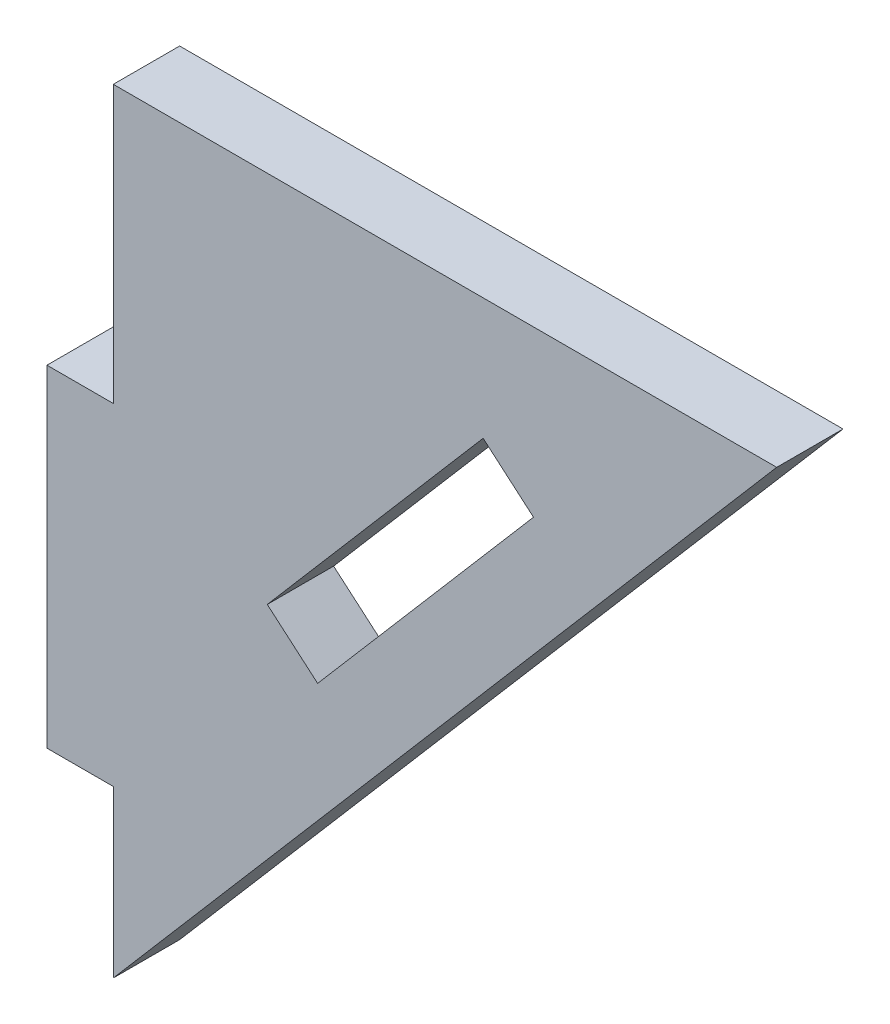
ISO-10303-21;
HEADER;
FILE_DESCRIPTION(('STEP AP214'),'2;1');
FILE_NAME('part.step','',(''),(''),'','','');
FILE_SCHEMA(('AUTOMOTIVE_DESIGN { 1 0 10303 214 1 1 1 1 }'));
ENDSEC;
DATA;
#1=APPLICATION_CONTEXT('core data for automotive mechanical design processes');
#2=APPLICATION_PROTOCOL_DEFINITION('international standard','automotive_design',2000,#1);
#3=PRODUCT_CONTEXT('',#1,'mechanical');
#4=PRODUCT('Part','Part','',(#3));
#5=PRODUCT_RELATED_PRODUCT_CATEGORY('part','',(#4));
#6=PRODUCT_DEFINITION_FORMATION('','',#4);
#7=PRODUCT_DEFINITION_CONTEXT('part definition',#1,'design');
#8=PRODUCT_DEFINITION('design','',#6,#7);
#9=PRODUCT_DEFINITION_SHAPE('','',#8);
#10=(LENGTH_UNIT() NAMED_UNIT(*) SI_UNIT(.MILLI.,.METRE.));
#11=(NAMED_UNIT(*) PLANE_ANGLE_UNIT() SI_UNIT($,.RADIAN.));
#12=(NAMED_UNIT(*) SI_UNIT($,.STERADIAN.) SOLID_ANGLE_UNIT());
#13=UNCERTAINTY_MEASURE_WITH_UNIT(LENGTH_MEASURE(1.E-05),#10,'distance_accuracy_value','');
#14=(GEOMETRIC_REPRESENTATION_CONTEXT(3) GLOBAL_UNCERTAINTY_ASSIGNED_CONTEXT((#13)) GLOBAL_UNIT_ASSIGNED_CONTEXT((#10,
#11,#12)) REPRESENTATION_CONTEXT('',''));
#15=CARTESIAN_POINT('',(0.,0.,0.));
#16=DIRECTION('',(0.,0.,1.));
#17=DIRECTION('',(1.,0.,0.));
#18=AXIS2_PLACEMENT_3D('',#15,#16,#17);
#19=CARTESIAN_POINT('',(-3.8926922259256,3.33659333650765,3.));
#20=DIRECTION('',(0.759256602365296,-0.650791373455968,0.));
#21=DIRECTION('',(0.650791373455968,0.759256602365297,0.));
#22=AXIS2_PLACEMENT_3D('',#19,#20,#21);
#23=PLANE('',#22);
#24=DIRECTION('',(-0.650791373455969,-0.759256602365297,0.));
#25=VECTOR('',#24,1.);
#26=CARTESIAN_POINT('',(-3.8926922259256,3.33659333650765,0.));
#27=LINE('',#26,#25);
#28=CARTESIAN_POINT('',(4.00247852532393,12.5476258796321,0.));
#29=VERTEX_POINT('',#28);
#30=CARTESIAN_POINT('',(-5.7593920765156,1.15877684415265,0.));
#31=VERTEX_POINT('',#30);
#32=EDGE_CURVE('E189',#29,#31,#27,.T.);
#33=ORIENTED_EDGE('',*,*,#32,.T.);
#34=DIRECTION('',(0.,0.,-1.));
#35=VECTOR('',#34,1.);
#36=CARTESIAN_POINT('',(-5.7593920765156,1.15877684415265,3.));
#37=LINE('',#36,#35);
#38=CARTESIAN_POINT('',(-5.7593920765156,1.15877684415265,3.));
#39=VERTEX_POINT('',#38);
#40=EDGE_CURVE('E11',#39,#31,#37,.T.);
#41=ORIENTED_EDGE('',*,*,#40,.F.);
#42=DIRECTION('',(-0.650791373455969,-0.759256602365297,0.));
#43=VECTOR('',#42,1.);
#44=CARTESIAN_POINT('',(-3.8926922259256,3.33659333650765,3.));
#45=LINE('',#44,#43);
#46=CARTESIAN_POINT('',(4.00247852532393,12.5476258796321,3.));
#47=VERTEX_POINT('',#46);
#48=EDGE_CURVE('E145',#47,#39,#45,.T.);
#49=ORIENTED_EDGE('',*,*,#48,.F.);
#50=DIRECTION('',(0.,0.,-1.));
#51=VECTOR('',#50,1.);
#52=CARTESIAN_POINT('',(4.00247852532393,12.5476258796321,3.));
#53=LINE('',#52,#51);
#54=EDGE_CURVE('E67',#47,#29,#53,.T.);
#55=ORIENTED_EDGE('',*,*,#54,.T.);
#56=EDGE_LOOP('',(#33,#41,#49,#55));
#57=FACE_BOUND('',#56,.T.);
#58=ADVANCED_FACE('F47',(#57),#23,.F.);
#59=CARTESIAN_POINT('',(-1.86669985059,-2.177816492355,3.));
#60=DIRECTION('',(-0.650791373455969,-0.759256602365297,0.));
#61=DIRECTION('',(0.759256602365297,-0.650791373455969,0.));
#62=AXIS2_PLACEMENT_3D('',#59,#60,#61);
#63=PLANE('',#62);
#64=DIRECTION('',(-0.759256602365296,0.650791373455969,0.));
#65=VECTOR('',#64,1.);
#66=CARTESIAN_POINT('',(-1.86669985059,-2.177816492355,0.));
#67=LINE('',#66,#65);
#68=CARTESIAN_POINT('',(-8.03716188361148,3.11115096452056,0.));
#69=VERTEX_POINT('',#68);
#70=EDGE_CURVE('E152',#31,#69,#67,.T.);
#71=ORIENTED_EDGE('',*,*,#70,.T.);
#72=DIRECTION('',(0.,0.,-1.));
#73=VECTOR('',#72,1.);
#74=CARTESIAN_POINT('',(-8.03716188361148,3.11115096452056,3.));
#75=LINE('',#74,#73);
#76=CARTESIAN_POINT('',(-8.03716188361148,3.11115096452056,3.));
#77=VERTEX_POINT('',#76);
#78=EDGE_CURVE('E58',#77,#69,#75,.T.);
#79=ORIENTED_EDGE('',*,*,#78,.F.);
#80=DIRECTION('',(-0.759256602365296,0.650791373455969,0.));
#81=VECTOR('',#80,1.);
#82=CARTESIAN_POINT('',(-1.86669985059,-2.177816492355,3.));
#83=LINE('',#82,#81);
#84=EDGE_CURVE('E139',#39,#77,#83,.T.);
#85=ORIENTED_EDGE('',*,*,#84,.F.);
#86=ORIENTED_EDGE('',*,*,#40,.T.);
#87=EDGE_LOOP('',(#71,#79,#85,#86));
#88=FACE_BOUND('',#87,.T.);
#89=ADVANCED_FACE('F151',(#88),#63,.F.);
#90=CARTESIAN_POINT('',(-6.17046203302148,5.28896745687555,3.));
#91=DIRECTION('',(0.759256602365297,-0.650791373455968,0.));
#92=DIRECTION('',(0.650791373455968,0.759256602365297,0.));
#93=AXIS2_PLACEMENT_3D('',#90,#91,#92);
#94=PLANE('',#93);
#95=DIRECTION('',(-0.650791373455968,-0.759256602365297,0.));
#96=VECTOR('',#95,1.);
#97=CARTESIAN_POINT('',(-6.17046203302148,5.28896745687555,0.));
#98=LINE('',#97,#96);
#99=CARTESIAN_POINT('',(1.72470871822804,14.5,0.));
#100=VERTEX_POINT('',#99);
#101=EDGE_CURVE('E194',#100,#69,#98,.T.);
#102=ORIENTED_EDGE('',*,*,#101,.F.);
#103=DIRECTION('',(0.,0.,-1.));
#104=VECTOR('',#103,1.);
#105=CARTESIAN_POINT('',(1.72470871822804,14.5,3.));
#106=LINE('',#105,#104);
#107=CARTESIAN_POINT('',(1.72470871822804,14.5,3.));
#108=VERTEX_POINT('',#107);
#109=EDGE_CURVE('E102',#108,#100,#106,.T.);
#110=ORIENTED_EDGE('',*,*,#109,.F.);
#111=DIRECTION('',(-0.650791373455968,-0.759256602365297,0.));
#112=VECTOR('',#111,1.);
#113=CARTESIAN_POINT('',(-6.17046203302148,5.28896745687555,3.));
#114=LINE('',#113,#112);
#115=EDGE_CURVE('E144',#108,#77,#114,.T.);
#116=ORIENTED_EDGE('',*,*,#115,.T.);
#117=ORIENTED_EDGE('',*,*,#78,.T.);
#118=EDGE_LOOP('',(#102,#110,#116,#117));
#119=FACE_BOUND('',#118,.T.);
#120=ADVANCED_FACE('F157',(#119),#94,.T.);
#121=CARTESIAN_POINT('',(-15.,0.,3.));
#122=DIRECTION('',(-1.,0.,0.));
#123=DIRECTION('',(0.,0.,1.));
#124=AXIS2_PLACEMENT_3D('',#121,#122,#123);
#125=PLANE('',#124);
#126=DIRECTION('',(0.,1.,0.));
#127=VECTOR('',#126,1.);
#128=CARTESIAN_POINT('',(-15.,0.,0.));
#129=LINE('',#128,#127);
#130=CARTESIAN_POINT('',(-15.,-15.,0.));
#131=VERTEX_POINT('',#130);
#132=CARTESIAN_POINT('',(-15.,-7.50000000000001,0.));
#133=VERTEX_POINT('',#132);
#134=EDGE_CURVE('E166',#131,#133,#129,.T.);
#135=ORIENTED_EDGE('',*,*,#134,.F.);
#136=DIRECTION('',(0.,0.,-1.));
#137=VECTOR('',#136,1.);
#138=CARTESIAN_POINT('',(-15.,-15.,3.));
#139=LINE('',#138,#137);
#140=CARTESIAN_POINT('',(-15.,-15.,3.));
#141=VERTEX_POINT('',#140);
#142=EDGE_CURVE('E51',#141,#131,#139,.T.);
#143=ORIENTED_EDGE('',*,*,#142,.F.);
#144=DIRECTION('',(0.,1.,0.));
#145=VECTOR('',#144,1.);
#146=CARTESIAN_POINT('',(-15.,0.,3.));
#147=LINE('',#146,#145);
#148=CARTESIAN_POINT('',(-15.,-7.50000000000001,3.));
#149=VERTEX_POINT('',#148);
#150=EDGE_CURVE('E201',#141,#149,#147,.T.);
#151=ORIENTED_EDGE('',*,*,#150,.T.);
#152=DIRECTION('',(0.,0.,-1.));
#153=VECTOR('',#152,1.);
#154=CARTESIAN_POINT('',(-15.,-7.50000000000001,3.));
#155=LINE('',#154,#153);
#156=EDGE_CURVE('E162',#149,#133,#155,.T.);
#157=ORIENTED_EDGE('',*,*,#156,.T.);
#158=EDGE_LOOP('',(#135,#143,#151,#157));
#159=FACE_BOUND('',#158,.T.);
#160=ADVANCED_FACE('F237',(#159),#125,.T.);
#161=CARTESIAN_POINT('',(-1.23529411764706,1.05882352941177,3.));
#162=DIRECTION('',(-0.759256602365297,0.650791373455968,0.));
#163=DIRECTION('',(-0.650791373455968,-0.759256602365297,0.));
#164=AXIS2_PLACEMENT_3D('',#161,#162,#163);
#165=PLANE('',#164);
#166=DIRECTION('',(0.650791373455968,0.759256602365297,0.));
#167=VECTOR('',#166,1.);
#168=CARTESIAN_POINT('',(-1.23529411764706,1.05882352941177,0.));
#169=LINE('',#168,#167);
#170=CARTESIAN_POINT('',(15.,20.,0.));
#171=VERTEX_POINT('',#170);
#172=EDGE_CURVE('E170',#131,#171,#169,.T.);
#173=ORIENTED_EDGE('',*,*,#172,.T.);
#174=DIRECTION('',(0.,0.,-1.));
#175=VECTOR('',#174,1.);
#176=CARTESIAN_POINT('',(15.,20.,3.));
#177=LINE('',#176,#175);
#178=CARTESIAN_POINT('',(15.,20.,3.));
#179=VERTEX_POINT('',#178);
#180=EDGE_CURVE('E220',#179,#171,#177,.T.);
#181=ORIENTED_EDGE('',*,*,#180,.F.);
#182=DIRECTION('',(0.650791373455968,0.759256602365297,0.));
#183=VECTOR('',#182,1.);
#184=CARTESIAN_POINT('',(-1.23529411764706,1.05882352941177,3.));
#185=LINE('',#184,#183);
#186=EDGE_CURVE('E230',#141,#179,#185,.T.);
#187=ORIENTED_EDGE('',*,*,#186,.F.);
#188=ORIENTED_EDGE('',*,*,#142,.T.);
#189=EDGE_LOOP('',(#173,#181,#187,#188));
#190=FACE_BOUND('',#189,.T.);
#191=ADVANCED_FACE('F49',(#190),#165,.F.);
#192=CARTESIAN_POINT('',(0.,20.,3.));
#193=DIRECTION('',(0.,-1.,0.));
#194=DIRECTION('',(1.,0.,0.));
#195=AXIS2_PLACEMENT_3D('',#192,#193,#194);
#196=PLANE('',#195);
#197=DIRECTION('',(-1.,0.,0.));
#198=VECTOR('',#197,1.);
#199=CARTESIAN_POINT('',(0.,20.,0.));
#200=LINE('',#199,#198);
#201=CARTESIAN_POINT('',(-15.,20.,0.));
#202=VERTEX_POINT('',#201);
#203=EDGE_CURVE('E174',#171,#202,#200,.T.);
#204=ORIENTED_EDGE('',*,*,#203,.T.);
#205=DIRECTION('',(0.,0.,-1.));
#206=VECTOR('',#205,1.);
#207=CARTESIAN_POINT('',(-15.,20.,3.));
#208=LINE('',#207,#206);
#209=CARTESIAN_POINT('',(-15.,20.,3.));
#210=VERTEX_POINT('',#209);
#211=EDGE_CURVE('E218',#210,#202,#208,.T.);
#212=ORIENTED_EDGE('',*,*,#211,.F.);
#213=DIRECTION('',(-1.,0.,0.));
#214=VECTOR('',#213,1.);
#215=CARTESIAN_POINT('',(0.,20.,3.));
#216=LINE('',#215,#214);
#217=EDGE_CURVE('E264',#179,#210,#216,.T.);
#218=ORIENTED_EDGE('',*,*,#217,.F.);
#219=ORIENTED_EDGE('',*,*,#180,.T.);
#220=EDGE_LOOP('',(#204,#212,#218,#219));
#221=FACE_BOUND('',#220,.T.);
#222=ADVANCED_FACE('F346',(#221),#196,.F.);
#223=CARTESIAN_POINT('',(-15.,7.49999999999999,0.));
#224=VERTEX_POINT('',#223);
#225=EDGE_CURVE('E171',#224,#202,#129,.T.);
#226=ORIENTED_EDGE('',*,*,#225,.F.);
#227=DIRECTION('',(0.,0.,-1.));
#228=VECTOR('',#227,1.);
#229=CARTESIAN_POINT('',(-15.,7.49999999999999,3.));
#230=LINE('',#229,#228);
#231=CARTESIAN_POINT('',(-15.,7.49999999999999,3.));
#232=VERTEX_POINT('',#231);
#233=EDGE_CURVE('E215',#232,#224,#230,.T.);
#234=ORIENTED_EDGE('',*,*,#233,.F.);
#235=EDGE_CURVE('E262',#232,#210,#147,.T.);
#236=ORIENTED_EDGE('',*,*,#235,.T.);
#237=ORIENTED_EDGE('',*,*,#211,.T.);
#238=EDGE_LOOP('',(#226,#234,#236,#237));
#239=FACE_BOUND('',#238,.T.);
#240=ADVANCED_FACE('F256',(#239),#125,.T.);
#241=CARTESIAN_POINT('',(0.,7.49999999999999,3.));
#242=DIRECTION('',(0.,1.,0.));
#243=DIRECTION('',(0.,0.,1.));
#244=AXIS2_PLACEMENT_3D('',#241,#242,#243);
#245=PLANE('',#244);
#246=DIRECTION('',(1.,0.,0.));
#247=VECTOR('',#246,1.);
#248=CARTESIAN_POINT('',(0.,7.49999999999999,0.));
#249=LINE('',#248,#247);
#250=CARTESIAN_POINT('',(-18.,7.49999999999999,0.));
#251=VERTEX_POINT('',#250);
#252=EDGE_CURVE('E178',#251,#224,#249,.T.);
#253=ORIENTED_EDGE('',*,*,#252,.F.);
#254=DIRECTION('',(0.,0.,-1.));
#255=VECTOR('',#254,1.);
#256=CARTESIAN_POINT('',(-18.,7.49999999999999,3.));
#257=LINE('',#256,#255);
#258=CARTESIAN_POINT('',(-18.,7.49999999999999,3.));
#259=VERTEX_POINT('',#258);
#260=EDGE_CURVE('E212',#259,#251,#257,.T.);
#261=ORIENTED_EDGE('',*,*,#260,.F.);
#262=DIRECTION('',(1.,0.,0.));
#263=VECTOR('',#262,1.);
#264=CARTESIAN_POINT('',(0.,7.49999999999999,3.));
#265=LINE('',#264,#263);
#266=EDGE_CURVE('E252',#259,#232,#265,.T.);
#267=ORIENTED_EDGE('',*,*,#266,.T.);
#268=ORIENTED_EDGE('',*,*,#233,.T.);
#269=EDGE_LOOP('',(#253,#261,#267,#268));
#270=FACE_BOUND('',#269,.T.);
#271=ADVANCED_FACE('F247',(#270),#245,.T.);
#272=CARTESIAN_POINT('',(-18.,0.,3.));
#273=DIRECTION('',(1.,0.,0.));
#274=DIRECTION('',(0.,1.,0.));
#275=AXIS2_PLACEMENT_3D('',#272,#273,#274);
#276=PLANE('',#275);
#277=DIRECTION('',(0.,-1.,0.));
#278=VECTOR('',#277,1.);
#279=CARTESIAN_POINT('',(-18.,0.,0.));
#280=LINE('',#279,#278);
#281=CARTESIAN_POINT('',(-18.,-7.50000000000001,0.));
#282=VERTEX_POINT('',#281);
#283=EDGE_CURVE('E182',#251,#282,#280,.T.);
#284=ORIENTED_EDGE('',*,*,#283,.T.);
#285=DIRECTION('',(0.,0.,-1.));
#286=VECTOR('',#285,1.);
#287=CARTESIAN_POINT('',(-18.,-7.50000000000001,3.));
#288=LINE('',#287,#286);
#289=CARTESIAN_POINT('',(-18.,-7.50000000000001,3.));
#290=VERTEX_POINT('',#289);
#291=EDGE_CURVE('E208',#290,#282,#288,.T.);
#292=ORIENTED_EDGE('',*,*,#291,.F.);
#293=DIRECTION('',(0.,-1.,0.));
#294=VECTOR('',#293,1.);
#295=CARTESIAN_POINT('',(-18.,0.,3.));
#296=LINE('',#295,#294);
#297=EDGE_CURVE('E270',#259,#290,#296,.T.);
#298=ORIENTED_EDGE('',*,*,#297,.F.);
#299=ORIENTED_EDGE('',*,*,#260,.T.);
#300=EDGE_LOOP('',(#284,#292,#298,#299));
#301=FACE_BOUND('',#300,.T.);
#302=ADVANCED_FACE('F278',(#301),#276,.F.);
#303=CARTESIAN_POINT('',(0.,-7.50000000000001,3.));
#304=DIRECTION('',(0.,1.,0.));
#305=DIRECTION('',(0.,0.,1.));
#306=AXIS2_PLACEMENT_3D('',#303,#304,#305);
#307=PLANE('',#306);
#308=DIRECTION('',(1.,0.,0.));
#309=VECTOR('',#308,1.);
#310=CARTESIAN_POINT('',(0.,-7.50000000000001,0.));
#311=LINE('',#310,#309);
#312=EDGE_CURVE('E185',#282,#133,#311,.T.);
#313=ORIENTED_EDGE('',*,*,#312,.T.);
#314=ORIENTED_EDGE('',*,*,#156,.F.);
#315=DIRECTION('',(1.,0.,0.));
#316=VECTOR('',#315,1.);
#317=CARTESIAN_POINT('',(0.,-7.50000000000001,3.));
#318=LINE('',#317,#316);
#319=EDGE_CURVE('E273',#290,#149,#318,.T.);
#320=ORIENTED_EDGE('',*,*,#319,.F.);
#321=ORIENTED_EDGE('',*,*,#291,.T.);
#322=EDGE_LOOP('',(#313,#314,#320,#321));
#323=FACE_BOUND('',#322,.T.);
#324=ADVANCED_FACE('F241',(#323),#307,.F.);
#325=CARTESIAN_POINT('',(7.89517075124953,9.21103254312445,3.));
#326=DIRECTION('',(-0.650791373455969,-0.759256602365297,0.));
#327=DIRECTION('',(0.759256602365297,-0.650791373455969,0.));
#328=AXIS2_PLACEMENT_3D('',#325,#326,#327);
#329=PLANE('',#328);
#330=DIRECTION('',(-0.759256602365296,0.650791373455969,0.));
#331=VECTOR('',#330,1.);
#332=CARTESIAN_POINT('',(7.89517075124953,9.21103254312445,0.));
#333=LINE('',#332,#331);
#334=EDGE_CURVE('E197',#29,#100,#333,.T.);
#335=ORIENTED_EDGE('',*,*,#334,.F.);
#336=ORIENTED_EDGE('',*,*,#54,.F.);
#337=DIRECTION('',(-0.759256602365296,0.650791373455969,0.));
#338=VECTOR('',#337,1.);
#339=CARTESIAN_POINT('',(7.89517075124953,9.21103254312445,3.));
#340=LINE('',#339,#338);
#341=EDGE_CURVE('E159',#47,#108,#340,.T.);
#342=ORIENTED_EDGE('',*,*,#341,.T.);
#343=ORIENTED_EDGE('',*,*,#109,.T.);
#344=EDGE_LOOP('',(#335,#336,#342,#343));
#345=FACE_BOUND('',#344,.T.);
#346=ADVANCED_FACE('F285',(#345),#329,.T.);
#347=CARTESIAN_POINT('',(0.,0.,3.));
#348=DIRECTION('',(0.,0.,1.));
#349=DIRECTION('',(1.,0.,0.));
#350=AXIS2_PLACEMENT_3D('',#347,#348,#349);
#351=PLANE('',#350);
#352=ORIENTED_EDGE('',*,*,#150,.F.);
#353=ORIENTED_EDGE('',*,*,#186,.T.);
#354=ORIENTED_EDGE('',*,*,#217,.T.);
#355=ORIENTED_EDGE('',*,*,#235,.F.);
#356=ORIENTED_EDGE('',*,*,#266,.F.);
#357=ORIENTED_EDGE('',*,*,#297,.T.);
#358=ORIENTED_EDGE('',*,*,#319,.T.);
#359=EDGE_LOOP('',(#352,#353,#354,#355,#356,#357,#358));
#360=FACE_BOUND('',#359,.T.);
#361=ORIENTED_EDGE('',*,*,#48,.T.);
#362=ORIENTED_EDGE('',*,*,#84,.T.);
#363=ORIENTED_EDGE('',*,*,#115,.F.);
#364=ORIENTED_EDGE('',*,*,#341,.F.);
#365=EDGE_LOOP('',(#361,#362,#363,#364));
#366=FACE_BOUND('',#365,.T.);
#367=ADVANCED_FACE('F141',(#360,#366),#351,.T.);
#368=CARTESIAN_POINT('',(0.,0.,0.));
#369=DIRECTION('',(0.,0.,1.));
#370=DIRECTION('',(1.,0.,0.));
#371=AXIS2_PLACEMENT_3D('',#368,#369,#370);
#372=PLANE('',#371);
#373=ORIENTED_EDGE('',*,*,#134,.T.);
#374=ORIENTED_EDGE('',*,*,#312,.F.);
#375=ORIENTED_EDGE('',*,*,#283,.F.);
#376=ORIENTED_EDGE('',*,*,#252,.T.);
#377=ORIENTED_EDGE('',*,*,#225,.T.);
#378=ORIENTED_EDGE('',*,*,#203,.F.);
#379=ORIENTED_EDGE('',*,*,#172,.F.);
#380=EDGE_LOOP('',(#373,#374,#375,#376,#377,#378,#379));
#381=FACE_BOUND('',#380,.T.);
#382=ORIENTED_EDGE('',*,*,#32,.F.);
#383=ORIENTED_EDGE('',*,*,#334,.T.);
#384=ORIENTED_EDGE('',*,*,#101,.T.);
#385=ORIENTED_EDGE('',*,*,#70,.F.);
#386=EDGE_LOOP('',(#382,#383,#384,#385));
#387=FACE_BOUND('',#386,.T.);
#388=ADVANCED_FACE('F233',(#381,#387),#372,.F.);
#389=CLOSED_SHELL('',(#58,#89,#120,#160,#191,#222,#240,#271,#302,#324,#346,#367,#388));
#390=MANIFOLD_SOLID_BREP('B2',#389);
#391=ADVANCED_BREP_SHAPE_REPRESENTATION('',(#18,#390),#14);
#392=SHAPE_DEFINITION_REPRESENTATION(#9,#391);
ENDSEC;
END-ISO-10303-21;
